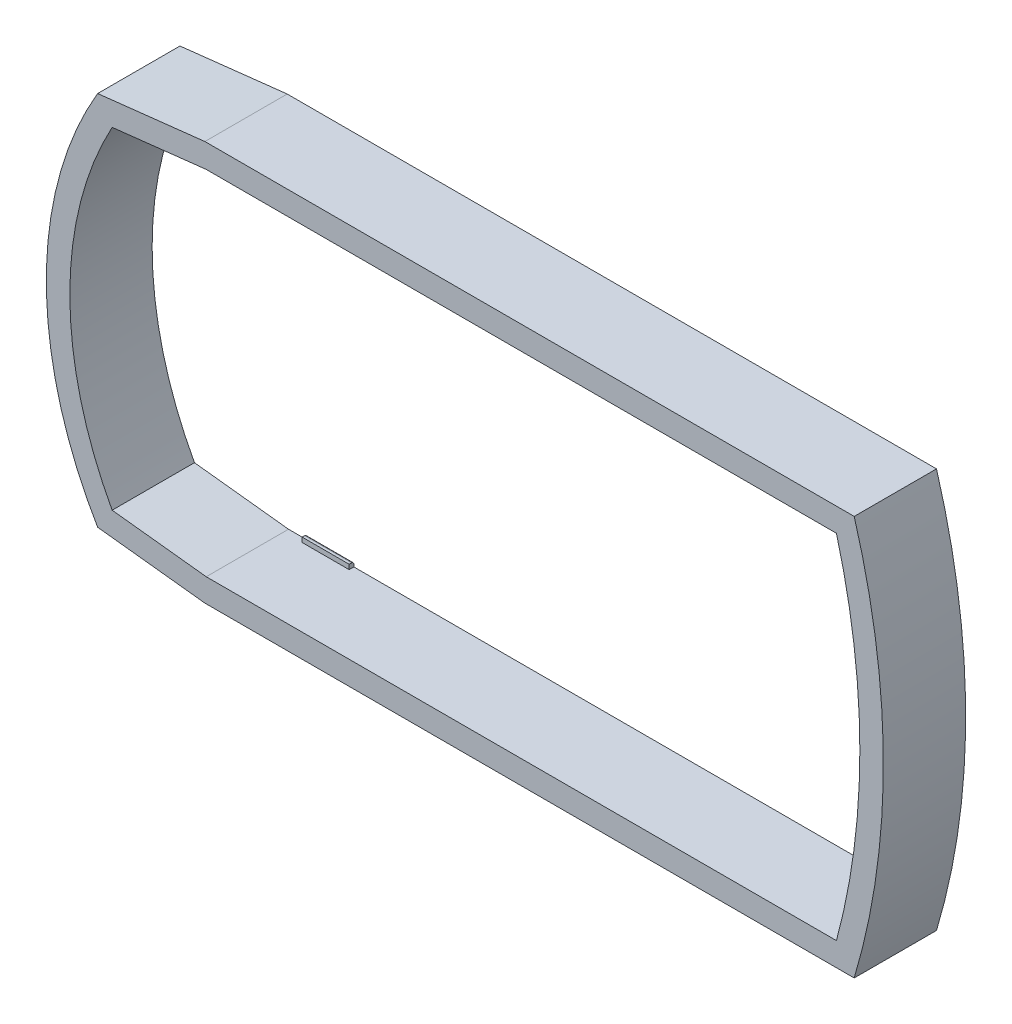
ISO-10303-21;
HEADER;
FILE_DESCRIPTION(('STEP AP214'),'2;1');
FILE_NAME('part.step','',(''),(''),'','','');
FILE_SCHEMA(('AUTOMOTIVE_DESIGN { 1 0 10303 214 1 1 1 1 }'));
ENDSEC;
DATA;
#1=APPLICATION_CONTEXT('core data for automotive mechanical design processes');
#2=APPLICATION_PROTOCOL_DEFINITION('international standard','automotive_design',2000,#1);
#3=PRODUCT_CONTEXT('',#1,'mechanical');
#4=PRODUCT('Part','Part','',(#3));
#5=PRODUCT_RELATED_PRODUCT_CATEGORY('part','',(#4));
#6=PRODUCT_DEFINITION_FORMATION('','',#4);
#7=PRODUCT_DEFINITION_CONTEXT('part definition',#1,'design');
#8=PRODUCT_DEFINITION('design','',#6,#7);
#9=PRODUCT_DEFINITION_SHAPE('','',#8);
#10=(LENGTH_UNIT() NAMED_UNIT(*) SI_UNIT(.MILLI.,.METRE.));
#11=(NAMED_UNIT(*) PLANE_ANGLE_UNIT() SI_UNIT($,.RADIAN.));
#12=(NAMED_UNIT(*) SI_UNIT($,.STERADIAN.) SOLID_ANGLE_UNIT());
#13=UNCERTAINTY_MEASURE_WITH_UNIT(LENGTH_MEASURE(1.E-05),#10,'distance_accuracy_value','');
#14=(GEOMETRIC_REPRESENTATION_CONTEXT(3) GLOBAL_UNCERTAINTY_ASSIGNED_CONTEXT((#13)) GLOBAL_UNIT_ASSIGNED_CONTEXT((#10,
#11,#12)) REPRESENTATION_CONTEXT('',''));
#15=CARTESIAN_POINT('',(0.,0.,0.));
#16=DIRECTION('',(0.,0.,1.));
#17=DIRECTION('',(1.,0.,0.));
#18=AXIS2_PLACEMENT_3D('',#15,#16,#17);
#19=CARTESIAN_POINT('',(0.,-14.6550184722738,2.));
#20=DIRECTION('',(0.,-1.,0.));
#21=DIRECTION('',(1.,0.,0.));
#22=AXIS2_PLACEMENT_3D('',#19,#20,#21);
#23=PLANE('',#22);
#24=DIRECTION('',(-1.,0.,0.));
#25=VECTOR('',#24,1.);
#26=CARTESIAN_POINT('',(0.,-14.6550184722738,0.));
#27=LINE('',#26,#25);
#28=CARTESIAN_POINT('',(124.911892491481,-14.6550184722737,0.));
#29=VERTEX_POINT('',#28);
#30=CARTESIAN_POINT('',(122.411892491481,-14.6550184722737,0.));
#31=VERTEX_POINT('',#30);
#32=EDGE_CURVE('E165',#29,#31,#27,.T.);
#33=ORIENTED_EDGE('',*,*,#32,.T.);
#34=CARTESIAN_POINT('',(122.411892491481,-14.6550184722737,0.5));
#35=DIRECTION('',(0.,-1.,0.));
#36=DIRECTION('',(1.,0.,0.));
#37=AXIS2_PLACEMENT_3D('',#34,#35,#36);
#38=CIRCLE('',#37,0.5);
#39=CARTESIAN_POINT('',(121.911892491481,-14.6550184722737,0.5));
#40=VERTEX_POINT('',#39);
#41=EDGE_CURVE('E13',#31,#40,#38,.F.);
#42=ORIENTED_EDGE('',*,*,#41,.T.);
#43=DIRECTION('',(0.,0.,-1.));
#44=VECTOR('',#43,1.);
#45=CARTESIAN_POINT('',(121.911892491481,-14.6550184722737,2.));
#46=LINE('',#45,#44);
#47=CARTESIAN_POINT('',(121.911892491481,-14.6550184722737,2.));
#48=VERTEX_POINT('',#47);
#49=EDGE_CURVE('E133',#48,#40,#46,.T.);
#50=ORIENTED_EDGE('',*,*,#49,.F.);
#51=DIRECTION('',(-1.,0.,0.));
#52=VECTOR('',#51,1.);
#53=CARTESIAN_POINT('',(0.,-14.6550184722738,2.));
#54=LINE('',#53,#52);
#55=CARTESIAN_POINT('',(124.911892491481,-14.6550184722737,2.));
#56=VERTEX_POINT('',#55);
#57=EDGE_CURVE('E140',#56,#48,#54,.T.);
#58=ORIENTED_EDGE('',*,*,#57,.F.);
#59=DIRECTION('',(0.,0.,-1.));
#60=VECTOR('',#59,1.);
#61=CARTESIAN_POINT('',(124.911892491481,-14.6550184722737,2.));
#62=LINE('',#61,#60);
#63=EDGE_CURVE('E159',#56,#29,#62,.T.);
#64=ORIENTED_EDGE('',*,*,#63,.T.);
#65=EDGE_LOOP('',(#33,#42,#50,#58,#64));
#66=FACE_BOUND('',#65,.T.);
#67=ADVANCED_FACE('F81',(#66),#23,.F.);
#68=CARTESIAN_POINT('',(121.911892491481,0.,2.));
#69=DIRECTION('',(1.,0.,0.));
#70=DIRECTION('',(0.,0.,-1.));
#71=AXIS2_PLACEMENT_3D('',#68,#69,#70);
#72=PLANE('',#71);
#73=ORIENTED_EDGE('',*,*,#49,.T.);
#74=DIRECTION('',(0.,-1.,0.));
#75=VECTOR('',#74,1.);
#76=CARTESIAN_POINT('',(121.911892491481,0.,0.5));
#77=LINE('',#76,#75);
#78=CARTESIAN_POINT('',(121.911892491481,-39.6550184722737,0.5));
#79=VERTEX_POINT('',#78);
#80=EDGE_CURVE('E151',#40,#79,#77,.T.);
#81=ORIENTED_EDGE('',*,*,#80,.T.);
#82=DIRECTION('',(0.,0.,-1.));
#83=VECTOR('',#82,1.);
#84=CARTESIAN_POINT('',(121.911892491481,-39.6550184722737,2.));
#85=LINE('',#84,#83);
#86=CARTESIAN_POINT('',(121.911892491481,-39.6550184722737,2.));
#87=VERTEX_POINT('',#86);
#88=EDGE_CURVE('E135',#87,#79,#85,.T.);
#89=ORIENTED_EDGE('',*,*,#88,.F.);
#90=DIRECTION('',(0.,-1.,0.));
#91=VECTOR('',#90,1.);
#92=CARTESIAN_POINT('',(121.911892491481,0.,2.));
#93=LINE('',#92,#91);
#94=EDGE_CURVE('E128',#48,#87,#93,.T.);
#95=ORIENTED_EDGE('',*,*,#94,.F.);
#96=EDGE_LOOP('',(#73,#81,#89,#95));
#97=FACE_BOUND('',#96,.T.);
#98=ADVANCED_FACE('F130',(#97),#72,.F.);
#99=CARTESIAN_POINT('',(0.,-39.6550184722737,2.));
#100=DIRECTION('',(0.,-1.,0.));
#101=DIRECTION('',(0.,0.,-1.));
#102=AXIS2_PLACEMENT_3D('',#99,#100,#101);
#103=PLANE('',#102);
#104=ORIENTED_EDGE('',*,*,#88,.T.);
#105=CARTESIAN_POINT('',(122.411892491481,-39.6550184722737,0.5));
#106=DIRECTION('',(0.,-1.,0.));
#107=DIRECTION('',(0.,0.,-1.));
#108=AXIS2_PLACEMENT_3D('',#105,#106,#107);
#109=CIRCLE('',#108,0.5);
#110=CARTESIAN_POINT('',(122.411892491481,-39.6550184722737,0.));
#111=VERTEX_POINT('',#110);
#112=EDGE_CURVE('E103',#79,#111,#109,.T.);
#113=ORIENTED_EDGE('',*,*,#112,.T.);
#114=DIRECTION('',(-1.,0.,0.));
#115=VECTOR('',#114,1.);
#116=CARTESIAN_POINT('',(0.,-39.6550184722737,0.));
#117=LINE('',#116,#115);
#118=CARTESIAN_POINT('',(124.911892491481,-39.6550184722737,0.));
#119=VERTEX_POINT('',#118);
#120=EDGE_CURVE('E163',#119,#111,#117,.T.);
#121=ORIENTED_EDGE('',*,*,#120,.F.);
#122=DIRECTION('',(0.,0.,-1.));
#123=VECTOR('',#122,1.);
#124=CARTESIAN_POINT('',(124.911892491481,-39.6550184722737,2.));
#125=LINE('',#124,#123);
#126=CARTESIAN_POINT('',(124.911892491481,-39.6550184722737,2.));
#127=VERTEX_POINT('',#126);
#128=EDGE_CURVE('E154',#127,#119,#125,.T.);
#129=ORIENTED_EDGE('',*,*,#128,.F.);
#130=DIRECTION('',(-1.,0.,0.));
#131=VECTOR('',#130,1.);
#132=CARTESIAN_POINT('',(0.,-39.6550184722737,2.));
#133=LINE('',#132,#131);
#134=EDGE_CURVE('E139',#127,#87,#133,.T.);
#135=ORIENTED_EDGE('',*,*,#134,.T.);
#136=EDGE_LOOP('',(#104,#113,#121,#129,#135));
#137=FACE_BOUND('',#136,.T.);
#138=ADVANCED_FACE('F168',(#137),#103,.T.);
#139=CARTESIAN_POINT('',(124.911892491481,0.,2.));
#140=DIRECTION('',(1.,0.,0.));
#141=DIRECTION('',(0.,0.,-1.));
#142=AXIS2_PLACEMENT_3D('',#139,#140,#141);
#143=PLANE('',#142);
#144=DIRECTION('',(0.,-1.,0.));
#145=VECTOR('',#144,1.);
#146=CARTESIAN_POINT('',(124.911892491481,0.,0.));
#147=LINE('',#146,#145);
#148=EDGE_CURVE('E148',#29,#119,#147,.T.);
#149=ORIENTED_EDGE('',*,*,#148,.F.);
#150=ORIENTED_EDGE('',*,*,#63,.F.);
#151=DIRECTION('',(0.,-1.,0.));
#152=VECTOR('',#151,1.);
#153=CARTESIAN_POINT('',(124.911892491481,0.,2.));
#154=LINE('',#153,#152);
#155=EDGE_CURVE('E146',#56,#127,#154,.T.);
#156=ORIENTED_EDGE('',*,*,#155,.T.);
#157=ORIENTED_EDGE('',*,*,#128,.T.);
#158=EDGE_LOOP('',(#149,#150,#156,#157));
#159=FACE_BOUND('',#158,.T.);
#160=ADVANCED_FACE('F171',(#159),#143,.T.);
#161=CARTESIAN_POINT('',(0.,0.,2.));
#162=DIRECTION('',(0.,0.,1.));
#163=DIRECTION('',(1.,0.,0.));
#164=AXIS2_PLACEMENT_3D('',#161,#162,#163);
#165=PLANE('',#164);
#166=ORIENTED_EDGE('',*,*,#57,.T.);
#167=ORIENTED_EDGE('',*,*,#94,.T.);
#168=ORIENTED_EDGE('',*,*,#134,.F.);
#169=ORIENTED_EDGE('',*,*,#155,.F.);
#170=EDGE_LOOP('',(#166,#167,#168,#169));
#171=FACE_BOUND('',#170,.T.);
#172=ADVANCED_FACE('F144',(#171),#165,.T.);
#173=CARTESIAN_POINT('',(0.,0.,0.));
#174=DIRECTION('',(0.,0.,1.));
#175=DIRECTION('',(1.,0.,0.));
#176=AXIS2_PLACEMENT_3D('',#173,#174,#175);
#177=PLANE('',#176);
#178=ORIENTED_EDGE('',*,*,#120,.T.);
#179=DIRECTION('',(0.,-1.,0.));
#180=VECTOR('',#179,1.);
#181=CARTESIAN_POINT('',(122.411892491481,0.,0.));
#182=LINE('',#181,#180);
#183=EDGE_CURVE('E89',#111,#31,#182,.F.);
#184=ORIENTED_EDGE('',*,*,#183,.T.);
#185=ORIENTED_EDGE('',*,*,#32,.F.);
#186=ORIENTED_EDGE('',*,*,#148,.T.);
#187=EDGE_LOOP('',(#178,#184,#185,#186));
#188=FACE_BOUND('',#187,.T.);
#189=ADVANCED_FACE('F172',(#188),#177,.F.);
#190=CARTESIAN_POINT('',(122.411892491481,0.,0.5));
#191=DIRECTION('',(0.,-1.,0.));
#192=DIRECTION('',(0.,0.,-1.));
#193=AXIS2_PLACEMENT_3D('',#190,#191,#192);
#194=CYLINDRICAL_SURFACE('',#193,0.5);
#195=ORIENTED_EDGE('',*,*,#41,.F.);
#196=ORIENTED_EDGE('',*,*,#183,.F.);
#197=ORIENTED_EDGE('',*,*,#112,.F.);
#198=ORIENTED_EDGE('',*,*,#80,.F.);
#199=EDGE_LOOP('',(#195,#196,#197,#198));
#200=FACE_BOUND('',#199,.T.);
#201=ADVANCED_FACE('F83',(#200),#194,.T.);
#202=CLOSED_SHELL('',(#67,#98,#138,#160,#172,#189,#201));
#203=MANIFOLD_SOLID_BREP('B2',#202);
#204=CARTESIAN_POINT('',(-152.77598661219,-102.155018472274,35.));
#205=DIRECTION('',(0.,1.,0.));
#206=DIRECTION('',(0.,0.,1.));
#207=AXIS2_PLACEMENT_3D('',#204,#205,#206);
#208=PLANE('',#207);
#209=DIRECTION('',(1.,0.,0.));
#210=VECTOR('',#209,1.);
#211=CARTESIAN_POINT('',(-152.77598661219,-102.155018472274,0.));
#212=LINE('',#211,#210);
#213=CARTESIAN_POINT('',(-124.987389645968,-102.155018472274,0.));
#214=VERTEX_POINT('',#213);
#215=CARTESIAN_POINT('',(115.22401338781,-102.155018472274,0.));
#216=VERTEX_POINT('',#215);
#217=EDGE_CURVE('E464',#214,#216,#212,.T.);
#218=ORIENTED_EDGE('',*,*,#217,.F.);
#219=DIRECTION('',(0.,0.,-1.));
#220=VECTOR('',#219,1.);
#221=CARTESIAN_POINT('',(-124.987389645968,-102.155018472274,2.));
#222=LINE('',#221,#220);
#223=CARTESIAN_POINT('',(-124.987389645968,-102.155018472274,2.));
#224=VERTEX_POINT('',#223);
#225=EDGE_CURVE('E442',#224,#214,#222,.T.);
#226=ORIENTED_EDGE('',*,*,#225,.F.);
#227=DIRECTION('',(1.,0.,0.));
#228=VECTOR('',#227,1.);
#229=CARTESIAN_POINT('',(0.,-102.155018472274,2.));
#230=LINE('',#229,#228);
#231=CARTESIAN_POINT('',(-144.987389645968,-102.155018472274,2.));
#232=VERTEX_POINT('',#231);
#233=EDGE_CURVE('E420',#232,#224,#230,.T.);
#234=ORIENTED_EDGE('',*,*,#233,.F.);
#235=DIRECTION('',(0.,0.,-1.));
#236=VECTOR('',#235,1.);
#237=CARTESIAN_POINT('',(-144.987389645968,-102.155018472274,2.));
#238=LINE('',#237,#236);
#239=CARTESIAN_POINT('',(-144.987389645968,-102.155018472274,0.));
#240=VERTEX_POINT('',#239);
#241=EDGE_CURVE('E432',#232,#240,#238,.T.);
#242=ORIENTED_EDGE('',*,*,#241,.T.);
#243=CARTESIAN_POINT('',(-152.77598661219,-102.155018472274,0.));
#244=VERTEX_POINT('',#243);
#245=EDGE_CURVE('E465',#244,#240,#212,.T.);
#246=ORIENTED_EDGE('',*,*,#245,.F.);
#247=DIRECTION('',(0.,0.,-1.));
#248=VECTOR('',#247,1.);
#249=CARTESIAN_POINT('',(-152.77598661219,-102.155018472274,35.));
#250=LINE('',#249,#248);
#251=CARTESIAN_POINT('',(-152.77598661219,-102.155018472274,35.));
#252=VERTEX_POINT('',#251);
#253=EDGE_CURVE('E491',#252,#244,#250,.T.);
#254=ORIENTED_EDGE('',*,*,#253,.F.);
#255=DIRECTION('',(1.,0.,0.));
#256=VECTOR('',#255,1.);
#257=CARTESIAN_POINT('',(-152.77598661219,-102.155018472274,35.));
#258=LINE('',#257,#256);
#259=CARTESIAN_POINT('',(115.22401338781,-102.155018472274,35.));
#260=VERTEX_POINT('',#259);
#261=EDGE_CURVE('E447',#252,#260,#258,.T.);
#262=ORIENTED_EDGE('',*,*,#261,.T.);
#263=DIRECTION('',(0.,0.,-1.));
#264=VECTOR('',#263,1.);
#265=CARTESIAN_POINT('',(115.22401338781,-102.155018472274,35.));
#266=LINE('',#265,#264);
#267=EDGE_CURVE('E488',#260,#216,#266,.T.);
#268=ORIENTED_EDGE('',*,*,#267,.T.);
#269=EDGE_LOOP('',(#218,#226,#234,#242,#246,#254,#262,#268));
#270=FACE_BOUND('',#269,.T.);
#271=ADVANCED_FACE('F231',(#270),#208,.T.);
#272=CARTESIAN_POINT('',(-162.17906632426,-27.1550184722737,35.));
#273=DIRECTION('',(0.,0.,1.));
#274=DIRECTION('',(1.,0.,0.));
#275=AXIS2_PLACEMENT_3D('',#272,#273,#274);
#276=PLANE('',#275);
#277=DIRECTION('',(0.993731316158802,-0.111794773067865,0.));
#278=VECTOR('',#277,1.);
#279=CARTESIAN_POINT('',(-193.893934342868,-107.592331633862,35.));
#280=LINE('',#279,#278);
#281=CARTESIAN_POINT('',(-198.953146911768,-107.023170219861,35.));
#282=VERTEX_POINT('',#281);
#283=CARTESIAN_POINT('',(-153.336718001429,-112.155018472274,35.));
#284=VERTEX_POINT('',#283);
#285=EDGE_CURVE('E495',#282,#284,#280,.T.);
#286=ORIENTED_EDGE('',*,*,#285,.T.);
#287=DIRECTION('',(1.,0.,0.));
#288=VECTOR('',#287,1.);
#289=CARTESIAN_POINT('',(-152.77598661219,-112.155018472274,35.));
#290=LINE('',#289,#288);
#291=CARTESIAN_POINT('',(122.776592961627,-112.155018472274,35.));
#292=VERTEX_POINT('',#291);
#293=EDGE_CURVE('E498',#284,#292,#290,.T.);
#294=ORIENTED_EDGE('',*,*,#293,.T.);
#295=CARTESIAN_POINT('',(-162.17906632426,-27.1550184722737,35.));
#296=DIRECTION('',(0.,0.,1.));
#297=DIRECTION('',(1.,0.,0.));
#298=AXIS2_PLACEMENT_3D('',#295,#296,#297);
#299=CIRCLE('',#298,297.362956265663);
#300=CARTESIAN_POINT('',(122.776592961627,57.8449815277263,35.));
#301=VERTEX_POINT('',#300);
#302=EDGE_CURVE('E501',#292,#301,#299,.T.);
#303=ORIENTED_EDGE('',*,*,#302,.T.);
#304=DIRECTION('',(1.,0.,0.));
#305=VECTOR('',#304,1.);
#306=CARTESIAN_POINT('',(-152.77598661219,57.8449815277263,35.));
#307=LINE('',#306,#305);
#308=CARTESIAN_POINT('',(-153.336718001428,57.8449815277263,35.));
#309=VERTEX_POINT('',#308);
#310=EDGE_CURVE('E503',#309,#301,#307,.T.);
#311=ORIENTED_EDGE('',*,*,#310,.F.);
#312=DIRECTION('',(0.993731316158802,0.111794773067865,0.));
#313=VECTOR('',#312,1.);
#314=CARTESIAN_POINT('',(-193.893934342868,53.2822946893143,35.));
#315=LINE('',#314,#313);
#316=CARTESIAN_POINT('',(-198.953146911768,52.713133275313,35.));
#317=VERTEX_POINT('',#316);
#318=EDGE_CURVE('E506',#317,#309,#315,.T.);
#319=ORIENTED_EDGE('',*,*,#318,.F.);
#320=CARTESIAN_POINT('',(-63.7022368600632,-27.1550184722737,35.));
#321=DIRECTION('',(0.,0.,1.));
#322=DIRECTION('',(1.,0.,0.));
#323=AXIS2_PLACEMENT_3D('',#320,#321,#322);
#324=CIRCLE('',#323,157.072372915767);
#325=EDGE_CURVE('E509',#282,#317,#324,.F.);
#326=ORIENTED_EDGE('',*,*,#325,.F.);
#327=EDGE_LOOP('',(#286,#294,#303,#311,#319,#326));
#328=FACE_BOUND('',#327,.T.);
#329=ORIENTED_EDGE('',*,*,#261,.F.);
#330=DIRECTION('',(0.993731316158802,-0.111794773067865,0.));
#331=VECTOR('',#330,1.);
#332=CARTESIAN_POINT('',(-192.77598661219,-97.6550184722737,35.));
#333=LINE('',#332,#331);
#334=CARTESIAN_POINT('',(-192.77598661219,-97.6550184722738,35.));
#335=VERTEX_POINT('',#334);
#336=EDGE_CURVE('E445',#335,#252,#333,.T.);
#337=ORIENTED_EDGE('',*,*,#336,.F.);
#338=CARTESIAN_POINT('',(-63.7022368600632,-27.1550184722737,35.));
#339=DIRECTION('',(0.,0.,-1.));
#340=DIRECTION('',(-1.,0.,0.));
#341=AXIS2_PLACEMENT_3D('',#338,#339,#340);
#342=CIRCLE('',#341,147.072372915767);
#343=CARTESIAN_POINT('',(-192.77598661219,43.3449815277263,35.));
#344=VERTEX_POINT('',#343);
#345=EDGE_CURVE('E458',#335,#344,#342,.T.);
#346=ORIENTED_EDGE('',*,*,#345,.T.);
#347=DIRECTION('',(0.993731316158802,0.111794773067865,0.));
#348=VECTOR('',#347,1.);
#349=CARTESIAN_POINT('',(-192.77598661219,43.3449815277263,35.));
#350=LINE('',#349,#348);
#351=CARTESIAN_POINT('',(-152.77598661219,47.8449815277263,35.));
#352=VERTEX_POINT('',#351);
#353=EDGE_CURVE('E455',#344,#352,#350,.T.);
#354=ORIENTED_EDGE('',*,*,#353,.T.);
#355=DIRECTION('',(1.,0.,0.));
#356=VECTOR('',#355,1.);
#357=CARTESIAN_POINT('',(-152.77598661219,47.8449815277263,35.));
#358=LINE('',#357,#356);
#359=CARTESIAN_POINT('',(115.22401338781,47.8449815277262,35.));
#360=VERTEX_POINT('',#359);
#361=EDGE_CURVE('E452',#352,#360,#358,.T.);
#362=ORIENTED_EDGE('',*,*,#361,.T.);
#363=CARTESIAN_POINT('',(-162.17906632426,-27.1550184722737,35.));
#364=DIRECTION('',(0.,0.,1.));
#365=DIRECTION('',(1.,0.,0.));
#366=AXIS2_PLACEMENT_3D('',#363,#364,#365);
#367=CIRCLE('',#366,287.362956265663);
#368=EDGE_CURVE('E450',#260,#360,#367,.T.);
#369=ORIENTED_EDGE('',*,*,#368,.F.);
#370=EDGE_LOOP('',(#329,#337,#346,#354,#362,#369));
#371=FACE_BOUND('',#370,.T.);
#372=ADVANCED_FACE('F573',(#328,#371),#276,.T.);
#373=CARTESIAN_POINT('',(-162.17906632426,-27.1550184722737,0.));
#374=DIRECTION('',(0.,0.,1.));
#375=DIRECTION('',(1.,0.,0.));
#376=AXIS2_PLACEMENT_3D('',#373,#374,#375);
#377=PLANE('',#376);
#378=DIRECTION('',(0.993731316158802,-0.111794773067865,0.));
#379=VECTOR('',#378,1.);
#380=CARTESIAN_POINT('',(-193.893934342868,-107.592331633862,0.));
#381=LINE('',#380,#379);
#382=CARTESIAN_POINT('',(-198.953146911768,-107.023170219861,0.));
#383=VERTEX_POINT('',#382);
#384=CARTESIAN_POINT('',(-153.336718001429,-112.155018472274,0.));
#385=VERTEX_POINT('',#384);
#386=EDGE_CURVE('E494',#383,#385,#381,.T.);
#387=ORIENTED_EDGE('',*,*,#386,.F.);
#388=CARTESIAN_POINT('',(-63.7022368600632,-27.1550184722737,0.));
#389=DIRECTION('',(0.,0.,1.));
#390=DIRECTION('',(1.,0.,0.));
#391=AXIS2_PLACEMENT_3D('',#388,#389,#390);
#392=CIRCLE('',#391,157.072372915767);
#393=CARTESIAN_POINT('',(-198.953146911768,52.713133275313,0.));
#394=VERTEX_POINT('',#393);
#395=EDGE_CURVE('E499',#383,#394,#392,.F.);
#396=ORIENTED_EDGE('',*,*,#395,.T.);
#397=DIRECTION('',(0.993731316158802,0.111794773067865,0.));
#398=VECTOR('',#397,1.);
#399=CARTESIAN_POINT('',(-193.893934342868,53.2822946893143,0.));
#400=LINE('',#399,#398);
#401=CARTESIAN_POINT('',(-153.336718001428,57.8449815277263,0.));
#402=VERTEX_POINT('',#401);
#403=EDGE_CURVE('E523',#394,#402,#400,.T.);
#404=ORIENTED_EDGE('',*,*,#403,.T.);
#405=DIRECTION('',(1.,0.,0.));
#406=VECTOR('',#405,1.);
#407=CARTESIAN_POINT('',(-152.77598661219,57.8449815277263,0.));
#408=LINE('',#407,#406);
#409=CARTESIAN_POINT('',(122.776592961627,57.8449815277263,0.));
#410=VERTEX_POINT('',#409);
#411=EDGE_CURVE('E520',#402,#410,#408,.T.);
#412=ORIENTED_EDGE('',*,*,#411,.T.);
#413=CARTESIAN_POINT('',(-162.17906632426,-27.1550184722737,0.));
#414=DIRECTION('',(0.,0.,1.));
#415=DIRECTION('',(1.,0.,0.));
#416=AXIS2_PLACEMENT_3D('',#413,#414,#415);
#417=CIRCLE('',#416,297.362956265663);
#418=CARTESIAN_POINT('',(122.776592961627,-112.155018472274,0.));
#419=VERTEX_POINT('',#418);
#420=EDGE_CURVE('E517',#419,#410,#417,.T.);
#421=ORIENTED_EDGE('',*,*,#420,.F.);
#422=DIRECTION('',(1.,0.,0.));
#423=VECTOR('',#422,1.);
#424=CARTESIAN_POINT('',(-152.77598661219,-112.155018472274,0.));
#425=LINE('',#424,#423);
#426=EDGE_CURVE('E515',#385,#419,#425,.T.);
#427=ORIENTED_EDGE('',*,*,#426,.F.);
#428=EDGE_LOOP('',(#387,#396,#404,#412,#421,#427));
#429=FACE_BOUND('',#428,.T.);
#430=DIRECTION('',(0.,1.,0.));
#431=VECTOR('',#430,1.);
#432=CARTESIAN_POINT('',(-144.987389645968,0.,0.));
#433=LINE('',#432,#431);
#434=CARTESIAN_POINT('',(-144.987389645968,-101.155018472274,0.));
#435=VERTEX_POINT('',#434);
#436=EDGE_CURVE('E424',#240,#435,#433,.T.);
#437=ORIENTED_EDGE('',*,*,#436,.T.);
#438=DIRECTION('',(1.,0.,0.));
#439=VECTOR('',#438,1.);
#440=CARTESIAN_POINT('',(-124.987389645968,-101.155018472274,0.));
#441=LINE('',#440,#439);
#442=CARTESIAN_POINT('',(-124.987389645968,-101.155018472274,0.));
#443=VERTEX_POINT('',#442);
#444=EDGE_CURVE('E548',#435,#443,#441,.T.);
#445=ORIENTED_EDGE('',*,*,#444,.T.);
#446=DIRECTION('',(0.,1.,0.));
#447=VECTOR('',#446,1.);
#448=CARTESIAN_POINT('',(-124.987389645968,0.,0.));
#449=LINE('',#448,#447);
#450=EDGE_CURVE('E419',#214,#443,#449,.T.);
#451=ORIENTED_EDGE('',*,*,#450,.F.);
#452=ORIENTED_EDGE('',*,*,#217,.T.);
#453=CARTESIAN_POINT('',(-162.17906632426,-27.1550184722737,0.));
#454=DIRECTION('',(0.,0.,1.));
#455=DIRECTION('',(1.,0.,0.));
#456=AXIS2_PLACEMENT_3D('',#453,#454,#455);
#457=CIRCLE('',#456,287.362956265663);
#458=CARTESIAN_POINT('',(115.22401338781,47.8449815277262,0.));
#459=VERTEX_POINT('',#458);
#460=EDGE_CURVE('E468',#216,#459,#457,.T.);
#461=ORIENTED_EDGE('',*,*,#460,.T.);
#462=DIRECTION('',(1.,0.,0.));
#463=VECTOR('',#462,1.);
#464=CARTESIAN_POINT('',(-152.77598661219,47.8449815277263,0.));
#465=LINE('',#464,#463);
#466=CARTESIAN_POINT('',(-124.987389645968,47.8449815277263,0.));
#467=VERTEX_POINT('',#466);
#468=EDGE_CURVE('E471',#467,#459,#465,.T.);
#469=ORIENTED_EDGE('',*,*,#468,.F.);
#470=DIRECTION('',(0.,-1.,0.));
#471=VECTOR('',#470,1.);
#472=CARTESIAN_POINT('',(-124.987389645968,8.67274236079684E-13,0.));
#473=LINE('',#472,#471);
#474=CARTESIAN_POINT('',(-124.987389645968,46.8449815277263,0.));
#475=VERTEX_POINT('',#474);
#476=EDGE_CURVE('E409',#467,#475,#473,.T.);
#477=ORIENTED_EDGE('',*,*,#476,.T.);
#478=DIRECTION('',(1.,0.,0.));
#479=VECTOR('',#478,1.);
#480=CARTESIAN_POINT('',(-162.17906632426,46.8449815277263,0.));
#481=LINE('',#480,#479);
#482=CARTESIAN_POINT('',(-144.987389645968,46.8449815277263,0.));
#483=VERTEX_POINT('',#482);
#484=EDGE_CURVE('E545',#475,#483,#481,.F.);
#485=ORIENTED_EDGE('',*,*,#484,.T.);
#486=DIRECTION('',(0.,-1.,0.));
#487=VECTOR('',#486,1.);
#488=CARTESIAN_POINT('',(-144.987389645968,0.,0.));
#489=LINE('',#488,#487);
#490=CARTESIAN_POINT('',(-144.987389645968,47.8449815277263,0.));
#491=VERTEX_POINT('',#490);
#492=EDGE_CURVE('E412',#491,#483,#489,.T.);
#493=ORIENTED_EDGE('',*,*,#492,.F.);
#494=CARTESIAN_POINT('',(-152.77598661219,47.8449815277263,0.));
#495=VERTEX_POINT('',#494);
#496=EDGE_CURVE('E472',#495,#491,#465,.T.);
#497=ORIENTED_EDGE('',*,*,#496,.F.);
#498=DIRECTION('',(0.993731316158802,0.111794773067865,0.));
#499=VECTOR('',#498,1.);
#500=CARTESIAN_POINT('',(-192.77598661219,43.3449815277263,0.));
#501=LINE('',#500,#499);
#502=CARTESIAN_POINT('',(-192.77598661219,43.3449815277263,0.));
#503=VERTEX_POINT('',#502);
#504=EDGE_CURVE('E474',#503,#495,#501,.T.);
#505=ORIENTED_EDGE('',*,*,#504,.F.);
#506=CARTESIAN_POINT('',(-63.7022368600632,-27.1550184722737,0.));
#507=DIRECTION('',(0.,0.,-1.));
#508=DIRECTION('',(-1.,0.,0.));
#509=AXIS2_PLACEMENT_3D('',#506,#507,#508);
#510=CIRCLE('',#509,147.072372915767);
#511=CARTESIAN_POINT('',(-192.77598661219,-97.6550184722738,0.));
#512=VERTEX_POINT('',#511);
#513=EDGE_CURVE('E448',#512,#503,#510,.T.);
#514=ORIENTED_EDGE('',*,*,#513,.F.);
#515=DIRECTION('',(0.993731316158802,-0.111794773067865,0.));
#516=VECTOR('',#515,1.);
#517=CARTESIAN_POINT('',(-192.77598661219,-97.6550184722737,0.));
#518=LINE('',#517,#516);
#519=EDGE_CURVE('E444',#512,#244,#518,.T.);
#520=ORIENTED_EDGE('',*,*,#519,.T.);
#521=ORIENTED_EDGE('',*,*,#245,.T.);
#522=EDGE_LOOP('',(#437,#445,#451,#452,#461,#469,#477,#485,#493,#497,#505,#514,#520,#521));
#523=FACE_BOUND('',#522,.T.);
#524=ADVANCED_FACE('F554',(#429,#523),#377,.F.);
#525=CARTESIAN_POINT('',(-193.893934342868,-107.592331633862,35.));
#526=DIRECTION('',(0.111794773067865,0.993731316158802,0.));
#527=DIRECTION('',(-0.993731316158802,0.111794773067865,0.));
#528=AXIS2_PLACEMENT_3D('',#525,#526,#527);
#529=PLANE('',#528);
#530=ORIENTED_EDGE('',*,*,#386,.T.);
#531=DIRECTION('',(0.,0.,-1.));
#532=VECTOR('',#531,1.);
#533=CARTESIAN_POINT('',(-153.336718001429,-112.155018472274,35.));
#534=LINE('',#533,#532);
#535=EDGE_CURVE('E538',#284,#385,#534,.T.);
#536=ORIENTED_EDGE('',*,*,#535,.F.);
#537=ORIENTED_EDGE('',*,*,#285,.F.);
#538=DIRECTION('',(0.,0.,-1.));
#539=VECTOR('',#538,1.);
#540=CARTESIAN_POINT('',(-198.953146911768,-107.023170219861,35.));
#541=LINE('',#540,#539);
#542=EDGE_CURVE('E512',#282,#383,#541,.T.);
#543=ORIENTED_EDGE('',*,*,#542,.T.);
#544=EDGE_LOOP('',(#530,#536,#537,#543));
#545=FACE_BOUND('',#544,.T.);
#546=ADVANCED_FACE('F621',(#545),#529,.F.);
#547=CARTESIAN_POINT('',(-152.77598661219,-112.155018472274,35.));
#548=DIRECTION('',(0.,1.,0.));
#549=DIRECTION('',(0.,0.,1.));
#550=AXIS2_PLACEMENT_3D('',#547,#548,#549);
#551=PLANE('',#550);
#552=ORIENTED_EDGE('',*,*,#426,.T.);
#553=DIRECTION('',(0.,0.,-1.));
#554=VECTOR('',#553,1.);
#555=CARTESIAN_POINT('',(122.776592961627,-112.155018472274,35.));
#556=LINE('',#555,#554);
#557=EDGE_CURVE('E535',#292,#419,#556,.T.);
#558=ORIENTED_EDGE('',*,*,#557,.F.);
#559=ORIENTED_EDGE('',*,*,#293,.F.);
#560=ORIENTED_EDGE('',*,*,#535,.T.);
#561=EDGE_LOOP('',(#552,#558,#559,#560));
#562=FACE_BOUND('',#561,.T.);
#563=ADVANCED_FACE('F637',(#562),#551,.F.);
#564=CARTESIAN_POINT('',(-162.17906632426,-27.1550184722737,35.));
#565=DIRECTION('',(0.,0.,-1.));
#566=DIRECTION('',(-1.,0.,0.));
#567=AXIS2_PLACEMENT_3D('',#564,#565,#566);
#568=CYLINDRICAL_SURFACE('',#567,297.362956265663);
#569=ORIENTED_EDGE('',*,*,#420,.T.);
#570=DIRECTION('',(0.,0.,-1.));
#571=VECTOR('',#570,1.);
#572=CARTESIAN_POINT('',(122.776592961627,57.8449815277263,35.));
#573=LINE('',#572,#571);
#574=EDGE_CURVE('E533',#301,#410,#573,.T.);
#575=ORIENTED_EDGE('',*,*,#574,.F.);
#576=ORIENTED_EDGE('',*,*,#302,.F.);
#577=ORIENTED_EDGE('',*,*,#557,.T.);
#578=EDGE_LOOP('',(#569,#575,#576,#577));
#579=FACE_BOUND('',#578,.T.);
#580=ADVANCED_FACE('F633',(#579),#568,.T.);
#581=CARTESIAN_POINT('',(-152.77598661219,57.8449815277263,35.));
#582=DIRECTION('',(0.,1.,0.));
#583=DIRECTION('',(0.,0.,1.));
#584=AXIS2_PLACEMENT_3D('',#581,#582,#583);
#585=PLANE('',#584);
#586=ORIENTED_EDGE('',*,*,#411,.F.);
#587=DIRECTION('',(0.,0.,-1.));
#588=VECTOR('',#587,1.);
#589=CARTESIAN_POINT('',(-153.336718001428,57.8449815277263,35.));
#590=LINE('',#589,#588);
#591=EDGE_CURVE('E531',#309,#402,#590,.T.);
#592=ORIENTED_EDGE('',*,*,#591,.F.);
#593=ORIENTED_EDGE('',*,*,#310,.T.);
#594=ORIENTED_EDGE('',*,*,#574,.T.);
#595=EDGE_LOOP('',(#586,#592,#593,#594));
#596=FACE_BOUND('',#595,.T.);
#597=ADVANCED_FACE('F629',(#596),#585,.T.);
#598=CARTESIAN_POINT('',(-193.893934342868,53.2822946893143,35.));
#599=DIRECTION('',(-0.111794773067865,0.993731316158802,0.));
#600=DIRECTION('',(-0.993731316158802,-0.111794773067865,0.));
#601=AXIS2_PLACEMENT_3D('',#598,#599,#600);
#602=PLANE('',#601);
#603=ORIENTED_EDGE('',*,*,#403,.F.);
#604=DIRECTION('',(0.,0.,-1.));
#605=VECTOR('',#604,1.);
#606=CARTESIAN_POINT('',(-198.953146911768,52.713133275313,35.));
#607=LINE('',#606,#605);
#608=EDGE_CURVE('E529',#317,#394,#607,.T.);
#609=ORIENTED_EDGE('',*,*,#608,.F.);
#610=ORIENTED_EDGE('',*,*,#318,.T.);
#611=ORIENTED_EDGE('',*,*,#591,.T.);
#612=EDGE_LOOP('',(#603,#609,#610,#611));
#613=FACE_BOUND('',#612,.T.);
#614=ADVANCED_FACE('F625',(#613),#602,.T.);
#615=CARTESIAN_POINT('',(-63.7022368600632,-27.1550184722737,35.));
#616=DIRECTION('',(0.,0.,-1.));
#617=DIRECTION('',(-1.,0.,0.));
#618=AXIS2_PLACEMENT_3D('',#615,#616,#617);
#619=CYLINDRICAL_SURFACE('',#618,157.072372915767);
#620=ORIENTED_EDGE('',*,*,#395,.F.);
#621=ORIENTED_EDGE('',*,*,#542,.F.);
#622=ORIENTED_EDGE('',*,*,#325,.T.);
#623=ORIENTED_EDGE('',*,*,#608,.T.);
#624=EDGE_LOOP('',(#620,#621,#622,#623));
#625=FACE_BOUND('',#624,.T.);
#626=ADVANCED_FACE('F616',(#625),#619,.T.);
#627=CARTESIAN_POINT('',(-192.77598661219,-97.6550184722737,35.));
#628=DIRECTION('',(0.111794773067865,0.993731316158802,0.));
#629=DIRECTION('',(-0.993731316158802,0.111794773067865,0.));
#630=AXIS2_PLACEMENT_3D('',#627,#628,#629);
#631=PLANE('',#630);
#632=ORIENTED_EDGE('',*,*,#519,.F.);
#633=DIRECTION('',(0.,0.,-1.));
#634=VECTOR('',#633,1.);
#635=CARTESIAN_POINT('',(-192.77598661219,-97.6550184722738,35.));
#636=LINE('',#635,#634);
#637=EDGE_CURVE('E461',#335,#512,#636,.T.);
#638=ORIENTED_EDGE('',*,*,#637,.F.);
#639=ORIENTED_EDGE('',*,*,#336,.T.);
#640=ORIENTED_EDGE('',*,*,#253,.T.);
#641=EDGE_LOOP('',(#632,#638,#639,#640));
#642=FACE_BOUND('',#641,.T.);
#643=ADVANCED_FACE('F614',(#642),#631,.T.);
#644=CARTESIAN_POINT('',(-162.17906632426,-27.1550184722737,35.));
#645=DIRECTION('',(0.,0.,-1.));
#646=DIRECTION('',(-1.,0.,0.));
#647=AXIS2_PLACEMENT_3D('',#644,#645,#646);
#648=CYLINDRICAL_SURFACE('',#647,287.362956265663);
#649=DIRECTION('',(0.,0.,-1.));
#650=VECTOR('',#649,1.);
#651=CARTESIAN_POINT('',(115.22401338781,47.8449815277262,35.));
#652=LINE('',#651,#650);
#653=EDGE_CURVE('E485',#360,#459,#652,.T.);
#654=ORIENTED_EDGE('',*,*,#653,.T.);
#655=ORIENTED_EDGE('',*,*,#460,.F.);
#656=ORIENTED_EDGE('',*,*,#267,.F.);
#657=ORIENTED_EDGE('',*,*,#368,.T.);
#658=EDGE_LOOP('',(#654,#655,#656,#657));
#659=FACE_BOUND('',#658,.T.);
#660=ADVANCED_FACE('F566',(#659),#648,.F.);
#661=CARTESIAN_POINT('',(-152.77598661219,47.8449815277263,35.));
#662=DIRECTION('',(0.,1.,0.));
#663=DIRECTION('',(0.,0.,1.));
#664=AXIS2_PLACEMENT_3D('',#661,#662,#663);
#665=PLANE('',#664);
#666=DIRECTION('',(1.,0.,0.));
#667=VECTOR('',#666,1.);
#668=CARTESIAN_POINT('',(0.,47.8449815277263,2.));
#669=LINE('',#668,#667);
#670=CARTESIAN_POINT('',(-144.987389645968,47.8449815277263,2.));
#671=VERTEX_POINT('',#670);
#672=CARTESIAN_POINT('',(-124.987389645968,47.8449815277263,2.));
#673=VERTEX_POINT('',#672);
#674=EDGE_CURVE('E386',#671,#673,#669,.T.);
#675=ORIENTED_EDGE('',*,*,#674,.T.);
#676=DIRECTION('',(0.,0.,-1.));
#677=VECTOR('',#676,1.);
#678=CARTESIAN_POINT('',(-124.987389645968,47.8449815277263,2.));
#679=LINE('',#678,#677);
#680=EDGE_CURVE('E416',#673,#467,#679,.T.);
#681=ORIENTED_EDGE('',*,*,#680,.T.);
#682=ORIENTED_EDGE('',*,*,#468,.T.);
#683=ORIENTED_EDGE('',*,*,#653,.F.);
#684=ORIENTED_EDGE('',*,*,#361,.F.);
#685=DIRECTION('',(0.,0.,-1.));
#686=VECTOR('',#685,1.);
#687=CARTESIAN_POINT('',(-152.77598661219,47.8449815277263,35.));
#688=LINE('',#687,#686);
#689=EDGE_CURVE('E483',#352,#495,#688,.T.);
#690=ORIENTED_EDGE('',*,*,#689,.T.);
#691=ORIENTED_EDGE('',*,*,#496,.T.);
#692=DIRECTION('',(0.,0.,-1.));
#693=VECTOR('',#692,1.);
#694=CARTESIAN_POINT('',(-144.987389645968,47.8449815277263,2.));
#695=LINE('',#694,#693);
#696=EDGE_CURVE('E399',#671,#491,#695,.T.);
#697=ORIENTED_EDGE('',*,*,#696,.F.);
#698=EDGE_LOOP('',(#675,#681,#682,#683,#684,#690,#691,#697));
#699=FACE_BOUND('',#698,.T.);
#700=ADVANCED_FACE('F570',(#699),#665,.F.);
#701=CARTESIAN_POINT('',(-192.77598661219,43.3449815277263,35.));
#702=DIRECTION('',(-0.111794773067865,0.993731316158802,0.));
#703=DIRECTION('',(-0.993731316158802,-0.111794773067865,0.));
#704=AXIS2_PLACEMENT_3D('',#701,#702,#703);
#705=PLANE('',#704);
#706=ORIENTED_EDGE('',*,*,#504,.T.);
#707=ORIENTED_EDGE('',*,*,#689,.F.);
#708=ORIENTED_EDGE('',*,*,#353,.F.);
#709=DIRECTION('',(0.,0.,-1.));
#710=VECTOR('',#709,1.);
#711=CARTESIAN_POINT('',(-192.77598661219,43.3449815277263,35.));
#712=LINE('',#711,#710);
#713=EDGE_CURVE('E481',#344,#503,#712,.T.);
#714=ORIENTED_EDGE('',*,*,#713,.T.);
#715=EDGE_LOOP('',(#706,#707,#708,#714));
#716=FACE_BOUND('',#715,.T.);
#717=ADVANCED_FACE('F578',(#716),#705,.F.);
#718=CARTESIAN_POINT('',(-63.7022368600632,-27.1550184722737,35.));
#719=DIRECTION('',(0.,0.,-1.));
#720=DIRECTION('',(-1.,0.,0.));
#721=AXIS2_PLACEMENT_3D('',#718,#719,#720);
#722=CYLINDRICAL_SURFACE('',#721,147.072372915767);
#723=ORIENTED_EDGE('',*,*,#513,.T.);
#724=ORIENTED_EDGE('',*,*,#713,.F.);
#725=ORIENTED_EDGE('',*,*,#345,.F.);
#726=ORIENTED_EDGE('',*,*,#637,.T.);
#727=EDGE_LOOP('',(#723,#724,#725,#726));
#728=FACE_BOUND('',#727,.T.);
#729=ADVANCED_FACE('F580',(#728),#722,.F.);
#730=CARTESIAN_POINT('',(-124.987389645968,0.,2.));
#731=DIRECTION('',(-1.,0.,0.));
#732=DIRECTION('',(0.,0.,1.));
#733=AXIS2_PLACEMENT_3D('',#730,#731,#732);
#734=PLANE('',#733);
#735=ORIENTED_EDGE('',*,*,#450,.T.);
#736=CARTESIAN_POINT('',(-124.987389645968,-101.155018472274,1.));
#737=DIRECTION('',(-1.,0.,0.));
#738=DIRECTION('',(0.,0.,1.));
#739=AXIS2_PLACEMENT_3D('',#736,#737,#738);
#740=CIRCLE('',#739,1.);
#741=CARTESIAN_POINT('',(-124.987389645968,-100.155018472274,1.));
#742=VERTEX_POINT('',#741);
#743=EDGE_CURVE('E253',#443,#742,#740,.F.);
#744=ORIENTED_EDGE('',*,*,#743,.T.);
#745=DIRECTION('',(0.,0.,-1.));
#746=VECTOR('',#745,1.);
#747=CARTESIAN_POINT('',(-124.987389645968,-100.155018472274,2.));
#748=LINE('',#747,#746);
#749=CARTESIAN_POINT('',(-124.987389645968,-100.155018472274,2.));
#750=VERTEX_POINT('',#749);
#751=EDGE_CURVE('E440',#750,#742,#748,.T.);
#752=ORIENTED_EDGE('',*,*,#751,.F.);
#753=DIRECTION('',(0.,1.,0.));
#754=VECTOR('',#753,1.);
#755=CARTESIAN_POINT('',(-124.987389645968,0.,2.));
#756=LINE('',#755,#754);
#757=EDGE_CURVE('E423',#224,#750,#756,.T.);
#758=ORIENTED_EDGE('',*,*,#757,.F.);
#759=ORIENTED_EDGE('',*,*,#225,.T.);
#760=EDGE_LOOP('',(#735,#744,#752,#758,#759));
#761=FACE_BOUND('',#760,.T.);
#762=ADVANCED_FACE('F558',(#761),#734,.F.);
#763=CARTESIAN_POINT('',(0.,-100.155018472274,2.));
#764=DIRECTION('',(0.,1.,0.));
#765=DIRECTION('',(0.,0.,1.));
#766=AXIS2_PLACEMENT_3D('',#763,#764,#765);
#767=PLANE('',#766);
#768=ORIENTED_EDGE('',*,*,#751,.T.);
#769=DIRECTION('',(1.,0.,0.));
#770=VECTOR('',#769,1.);
#771=CARTESIAN_POINT('',(-144.987389645968,-100.155018472274,1.));
#772=LINE('',#771,#770);
#773=CARTESIAN_POINT('',(-144.987389645968,-100.155018472274,1.));
#774=VERTEX_POINT('',#773);
#775=EDGE_CURVE('E239',#742,#774,#772,.F.);
#776=ORIENTED_EDGE('',*,*,#775,.T.);
#777=DIRECTION('',(0.,0.,-1.));
#778=VECTOR('',#777,1.);
#779=CARTESIAN_POINT('',(-144.987389645968,-100.155018472274,2.));
#780=LINE('',#779,#778);
#781=CARTESIAN_POINT('',(-144.987389645968,-100.155018472274,2.));
#782=VERTEX_POINT('',#781);
#783=EDGE_CURVE('E438',#782,#774,#780,.T.);
#784=ORIENTED_EDGE('',*,*,#783,.F.);
#785=DIRECTION('',(1.,0.,0.));
#786=VECTOR('',#785,1.);
#787=CARTESIAN_POINT('',(0.,-100.155018472274,2.));
#788=LINE('',#787,#786);
#789=EDGE_CURVE('E426',#782,#750,#788,.T.);
#790=ORIENTED_EDGE('',*,*,#789,.T.);
#791=EDGE_LOOP('',(#768,#776,#784,#790));
#792=FACE_BOUND('',#791,.T.);
#793=ADVANCED_FACE('F777',(#792),#767,.T.);
#794=CARTESIAN_POINT('',(-144.987389645968,0.,2.));
#795=DIRECTION('',(-1.,0.,0.));
#796=DIRECTION('',(0.,0.,1.));
#797=AXIS2_PLACEMENT_3D('',#794,#795,#796);
#798=PLANE('',#797);
#799=ORIENTED_EDGE('',*,*,#783,.T.);
#800=CARTESIAN_POINT('',(-144.987389645968,-101.155018472274,1.));
#801=DIRECTION('',(-1.,0.,0.));
#802=DIRECTION('',(0.,0.,1.));
#803=AXIS2_PLACEMENT_3D('',#800,#801,#802);
#804=CIRCLE('',#803,1.);
#805=EDGE_CURVE('E79',#774,#435,#804,.T.);
#806=ORIENTED_EDGE('',*,*,#805,.T.);
#807=ORIENTED_EDGE('',*,*,#436,.F.);
#808=ORIENTED_EDGE('',*,*,#241,.F.);
#809=DIRECTION('',(0.,1.,0.));
#810=VECTOR('',#809,1.);
#811=CARTESIAN_POINT('',(-144.987389645968,0.,2.));
#812=LINE('',#811,#810);
#813=EDGE_CURVE('E429',#232,#782,#812,.T.);
#814=ORIENTED_EDGE('',*,*,#813,.T.);
#815=EDGE_LOOP('',(#799,#806,#807,#808,#814));
#816=FACE_BOUND('',#815,.T.);
#817=ADVANCED_FACE('F601',(#816),#798,.T.);
#818=CARTESIAN_POINT('',(0.,0.,2.));
#819=DIRECTION('',(0.,0.,1.));
#820=DIRECTION('',(1.,0.,0.));
#821=AXIS2_PLACEMENT_3D('',#818,#819,#820);
#822=PLANE('',#821);
#823=ORIENTED_EDGE('',*,*,#233,.T.);
#824=ORIENTED_EDGE('',*,*,#757,.T.);
#825=ORIENTED_EDGE('',*,*,#789,.F.);
#826=ORIENTED_EDGE('',*,*,#813,.F.);
#827=EDGE_LOOP('',(#823,#824,#825,#826));
#828=FACE_BOUND('',#827,.T.);
#829=ADVANCED_FACE('F594',(#828),#822,.T.);
#830=CARTESIAN_POINT('',(-124.987389645968,8.67274236079684E-13,2.));
#831=DIRECTION('',(1.,0.,0.));
#832=DIRECTION('',(0.,1.,0.));
#833=AXIS2_PLACEMENT_3D('',#830,#831,#832);
#834=PLANE('',#833);
#835=DIRECTION('',(0.,0.,-1.));
#836=VECTOR('',#835,1.);
#837=CARTESIAN_POINT('',(-124.987389645968,45.8449815277263,2.));
#838=LINE('',#837,#836);
#839=CARTESIAN_POINT('',(-124.987389645968,45.8449815277263,2.));
#840=VERTEX_POINT('',#839);
#841=CARTESIAN_POINT('',(-124.987389645968,45.8449815277263,1.));
#842=VERTEX_POINT('',#841);
#843=EDGE_CURVE('E400',#840,#842,#838,.T.);
#844=ORIENTED_EDGE('',*,*,#843,.T.);
#845=CARTESIAN_POINT('',(-124.987389645968,46.8449815277263,1.));
#846=DIRECTION('',(1.,0.,0.));
#847=DIRECTION('',(0.,1.,0.));
#848=AXIS2_PLACEMENT_3D('',#845,#846,#847);
#849=CIRCLE('',#848,1.);
#850=EDGE_CURVE('E543',#842,#475,#849,.T.);
#851=ORIENTED_EDGE('',*,*,#850,.T.);
#852=ORIENTED_EDGE('',*,*,#476,.F.);
#853=ORIENTED_EDGE('',*,*,#680,.F.);
#854=DIRECTION('',(0.,-1.,0.));
#855=VECTOR('',#854,1.);
#856=CARTESIAN_POINT('',(-124.987389645968,8.67274236079684E-13,2.));
#857=LINE('',#856,#855);
#858=EDGE_CURVE('E413',#673,#840,#857,.T.);
#859=ORIENTED_EDGE('',*,*,#858,.T.);
#860=EDGE_LOOP('',(#844,#851,#852,#853,#859));
#861=FACE_BOUND('',#860,.T.);
#862=ADVANCED_FACE('F589',(#861),#834,.T.);
#863=CARTESIAN_POINT('',(-144.987389645968,0.,2.));
#864=DIRECTION('',(1.,0.,0.));
#865=DIRECTION('',(0.,0.,-1.));
#866=AXIS2_PLACEMENT_3D('',#863,#864,#865);
#867=PLANE('',#866);
#868=ORIENTED_EDGE('',*,*,#492,.T.);
#869=CARTESIAN_POINT('',(-144.987389645968,46.8449815277263,1.));
#870=DIRECTION('',(1.,0.,0.));
#871=DIRECTION('',(0.,0.,-1.));
#872=AXIS2_PLACEMENT_3D('',#869,#870,#871);
#873=CIRCLE('',#872,1.);
#874=CARTESIAN_POINT('',(-144.987389645968,45.8449815277263,1.));
#875=VERTEX_POINT('',#874);
#876=EDGE_CURVE('E395',#483,#875,#873,.F.);
#877=ORIENTED_EDGE('',*,*,#876,.T.);
#878=DIRECTION('',(0.,0.,-1.));
#879=VECTOR('',#878,1.);
#880=CARTESIAN_POINT('',(-144.987389645968,45.8449815277263,2.));
#881=LINE('',#880,#879);
#882=CARTESIAN_POINT('',(-144.987389645968,45.8449815277263,2.));
#883=VERTEX_POINT('',#882);
#884=EDGE_CURVE('E391',#883,#875,#881,.T.);
#885=ORIENTED_EDGE('',*,*,#884,.F.);
#886=DIRECTION('',(0.,-1.,0.));
#887=VECTOR('',#886,1.);
#888=CARTESIAN_POINT('',(-144.987389645968,0.,2.));
#889=LINE('',#888,#887);
#890=EDGE_CURVE('E379',#671,#883,#889,.T.);
#891=ORIENTED_EDGE('',*,*,#890,.F.);
#892=ORIENTED_EDGE('',*,*,#696,.T.);
#893=EDGE_LOOP('',(#868,#877,#885,#891,#892));
#894=FACE_BOUND('',#893,.T.);
#895=ADVANCED_FACE('F393',(#894),#867,.F.);
#896=CARTESIAN_POINT('',(0.,45.8449815277263,2.));
#897=DIRECTION('',(0.,1.,0.));
#898=DIRECTION('',(0.,0.,1.));
#899=AXIS2_PLACEMENT_3D('',#896,#897,#898);
#900=PLANE('',#899);
#901=ORIENTED_EDGE('',*,*,#884,.T.);
#902=DIRECTION('',(1.,0.,0.));
#903=VECTOR('',#902,1.);
#904=CARTESIAN_POINT('',(0.,45.8449815277263,1.));
#905=LINE('',#904,#903);
#906=EDGE_CURVE('E541',#875,#842,#905,.T.);
#907=ORIENTED_EDGE('',*,*,#906,.T.);
#908=ORIENTED_EDGE('',*,*,#843,.F.);
#909=DIRECTION('',(1.,0.,0.));
#910=VECTOR('',#909,1.);
#911=CARTESIAN_POINT('',(0.,45.8449815277263,2.));
#912=LINE('',#911,#910);
#913=EDGE_CURVE('E384',#883,#840,#912,.T.);
#914=ORIENTED_EDGE('',*,*,#913,.F.);
#915=EDGE_LOOP('',(#901,#907,#908,#914));
#916=FACE_BOUND('',#915,.T.);
#917=ADVANCED_FACE('F402',(#916),#900,.F.);
#918=CARTESIAN_POINT('',(0.,0.,2.));
#919=DIRECTION('',(0.,0.,1.));
#920=DIRECTION('',(1.,0.,0.));
#921=AXIS2_PLACEMENT_3D('',#918,#919,#920);
#922=PLANE('',#921);
#923=ORIENTED_EDGE('',*,*,#858,.F.);
#924=ORIENTED_EDGE('',*,*,#674,.F.);
#925=ORIENTED_EDGE('',*,*,#890,.T.);
#926=ORIENTED_EDGE('',*,*,#913,.T.);
#927=EDGE_LOOP('',(#923,#924,#925,#926));
#928=FACE_BOUND('',#927,.T.);
#929=ADVANCED_FACE('F382',(#928),#922,.T.);
#930=CARTESIAN_POINT('',(0.,46.8449815277263,1.));
#931=DIRECTION('',(1.,0.,0.));
#932=DIRECTION('',(0.,0.,-1.));
#933=AXIS2_PLACEMENT_3D('',#930,#931,#932);
#934=CYLINDRICAL_SURFACE('',#933,1.);
#935=ORIENTED_EDGE('',*,*,#876,.F.);
#936=ORIENTED_EDGE('',*,*,#484,.F.);
#937=ORIENTED_EDGE('',*,*,#850,.F.);
#938=ORIENTED_EDGE('',*,*,#906,.F.);
#939=EDGE_LOOP('',(#935,#936,#937,#938));
#940=FACE_BOUND('',#939,.T.);
#941=ADVANCED_FACE('F587',(#940),#934,.T.);
#942=CARTESIAN_POINT('',(-162.17906632426,-101.155018472274,1.));
#943=DIRECTION('',(-1.,0.,0.));
#944=DIRECTION('',(0.,0.,1.));
#945=AXIS2_PLACEMENT_3D('',#942,#943,#944);
#946=CYLINDRICAL_SURFACE('',#945,1.);
#947=ORIENTED_EDGE('',*,*,#805,.F.);
#948=ORIENTED_EDGE('',*,*,#775,.F.);
#949=ORIENTED_EDGE('',*,*,#743,.F.);
#950=ORIENTED_EDGE('',*,*,#444,.F.);
#951=EDGE_LOOP('',(#947,#948,#949,#950));
#952=FACE_BOUND('',#951,.T.);
#953=ADVANCED_FACE('F233',(#952),#946,.T.);
#954=CLOSED_SHELL('',(#271,#372,#524,#546,#563,#580,#597,#614,#626,#643,#660,#700,#717,#729,
#762,#793,#817,#829,#862,#895,#917,#929,#941,#953));
#955=MANIFOLD_SOLID_BREP('B7',#954);
#956=ADVANCED_BREP_SHAPE_REPRESENTATION('',(#18,#203,#955),#14);
#957=SHAPE_DEFINITION_REPRESENTATION(#9,#956);
ENDSEC;
END-ISO-10303-21;
